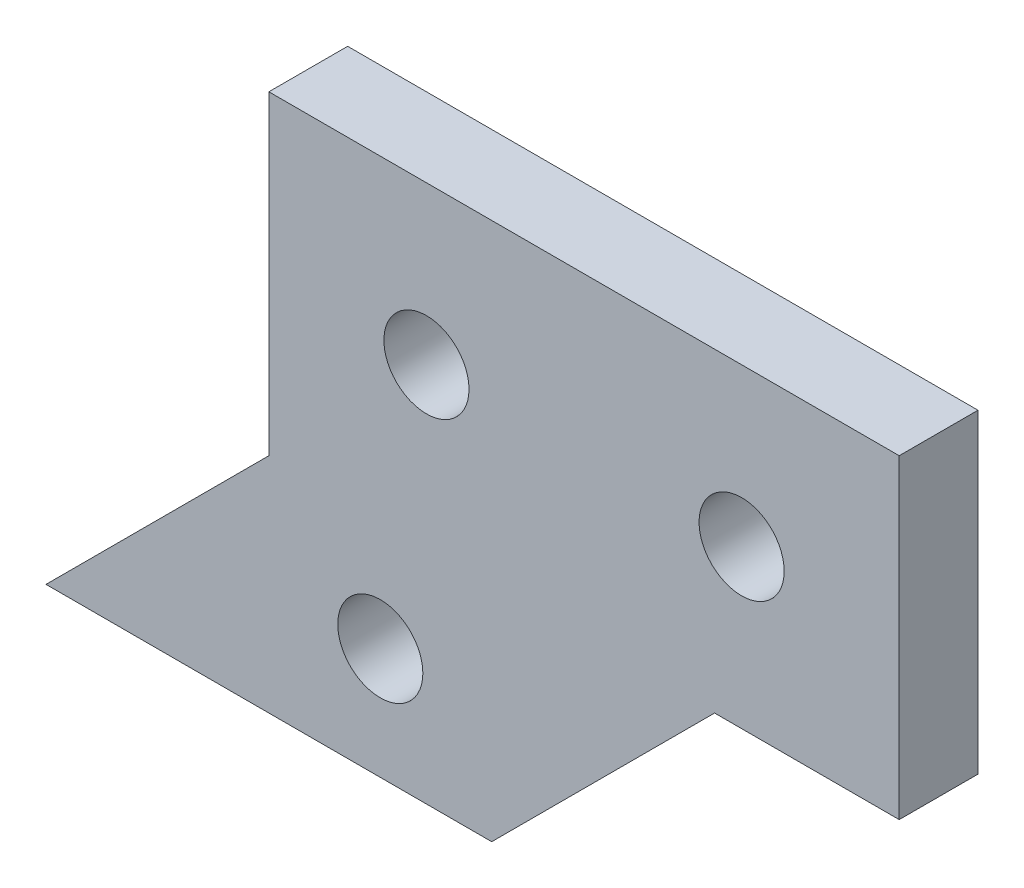
ISO-10303-21;
HEADER;
FILE_DESCRIPTION(('STEP AP214'),'2;1');
FILE_NAME('part.step','',(''),(''),'','','');
FILE_SCHEMA(('AUTOMOTIVE_DESIGN { 1 0 10303 214 1 1 1 1 }'));
ENDSEC;
DATA;
#1=APPLICATION_CONTEXT('core data for automotive mechanical design processes');
#2=APPLICATION_PROTOCOL_DEFINITION('international standard','automotive_design',2000,#1);
#3=PRODUCT_CONTEXT('',#1,'mechanical');
#4=PRODUCT('Part','Part','',(#3));
#5=PRODUCT_RELATED_PRODUCT_CATEGORY('part','',(#4));
#6=PRODUCT_DEFINITION_FORMATION('','',#4);
#7=PRODUCT_DEFINITION_CONTEXT('part definition',#1,'design');
#8=PRODUCT_DEFINITION('design','',#6,#7);
#9=PRODUCT_DEFINITION_SHAPE('','',#8);
#10=(LENGTH_UNIT() NAMED_UNIT(*) SI_UNIT(.MILLI.,.METRE.));
#11=(NAMED_UNIT(*) PLANE_ANGLE_UNIT() SI_UNIT($,.RADIAN.));
#12=(NAMED_UNIT(*) SI_UNIT($,.STERADIAN.) SOLID_ANGLE_UNIT());
#13=UNCERTAINTY_MEASURE_WITH_UNIT(LENGTH_MEASURE(1.E-05),#10,'distance_accuracy_value','');
#14=(GEOMETRIC_REPRESENTATION_CONTEXT(3) GLOBAL_UNCERTAINTY_ASSIGNED_CONTEXT((#13)) GLOBAL_UNIT_ASSIGNED_CONTEXT((#10,
#11,#12)) REPRESENTATION_CONTEXT('',''));
#15=CARTESIAN_POINT('',(0.,0.,0.));
#16=DIRECTION('',(0.,0.,1.));
#17=DIRECTION('',(1.,0.,0.));
#18=AXIS2_PLACEMENT_3D('',#15,#16,#17);
#19=CARTESIAN_POINT('',(0.,0.,6.35));
#20=DIRECTION('',(0.,0.,1.));
#21=DIRECTION('',(1.,0.,0.));
#22=AXIS2_PLACEMENT_3D('',#19,#20,#21);
#23=PLANE('',#22);
#24=CARTESIAN_POINT('',(38.1,-12.7,6.35));
#25=DIRECTION('',(0.,0.,1.));
#26=DIRECTION('',(1.,0.,0.));
#27=AXIS2_PLACEMENT_3D('',#24,#25,#26);
#28=CIRCLE('',#27,3.429);
#29=CARTESIAN_POINT('',(41.529,-12.7,6.35));
#30=VERTEX_POINT('',#29);
#31=EDGE_CURVE('E192',#30,#30,#28,.T.);
#32=ORIENTED_EDGE('',*,*,#31,.F.);
#33=EDGE_LOOP('',(#32));
#34=FACE_BOUND('',#33,.T.);
#35=DIRECTION('',(0.,-1.,0.));
#36=VECTOR('',#35,1.);
#37=CARTESIAN_POINT('',(0.,0.,6.35));
#38=LINE('',#37,#36);
#39=CARTESIAN_POINT('',(0.,0.,6.35));
#40=VERTEX_POINT('',#39);
#41=CARTESIAN_POINT('',(0.,-25.4,6.35));
#42=VERTEX_POINT('',#41);
#43=EDGE_CURVE('E155',#40,#42,#38,.T.);
#44=ORIENTED_EDGE('',*,*,#43,.T.);
#45=DIRECTION('',(-0.707106781186546,-0.707106781186549,0.));
#46=VECTOR('',#45,1.);
#47=CARTESIAN_POINT('',(0.,-25.4,6.35));
#48=LINE('',#47,#46);
#49=CARTESIAN_POINT('',(-17.9605122421383,-43.3605122421383,6.35));
#50=VERTEX_POINT('',#49);
#51=EDGE_CURVE('E97',#42,#50,#48,.T.);
#52=ORIENTED_EDGE('',*,*,#51,.T.);
#53=DIRECTION('',(1.,0.,0.));
#54=VECTOR('',#53,1.);
#55=CARTESIAN_POINT('',(-17.9605122421383,-43.3605122421383,6.35));
#56=LINE('',#55,#54);
#57=CARTESIAN_POINT('',(17.9605122421383,-43.3605122421383,6.35));
#58=VERTEX_POINT('',#57);
#59=EDGE_CURVE('E172',#50,#58,#56,.T.);
#60=ORIENTED_EDGE('',*,*,#59,.T.);
#61=DIRECTION('',(0.707106781186546,0.707106781186549,0.));
#62=VECTOR('',#61,1.);
#63=CARTESIAN_POINT('',(35.9210244842765,-25.4,6.35));
#64=LINE('',#63,#62);
#65=CARTESIAN_POINT('',(35.9210244842765,-25.4,6.35));
#66=VERTEX_POINT('',#65);
#67=EDGE_CURVE('E113',#58,#66,#64,.T.);
#68=ORIENTED_EDGE('',*,*,#67,.T.);
#69=DIRECTION('',(1.,0.,0.));
#70=VECTOR('',#69,1.);
#71=CARTESIAN_POINT('',(35.9210244842765,-25.4,6.35));
#72=LINE('',#71,#70);
#73=CARTESIAN_POINT('',(50.8,-25.4,6.35));
#74=VERTEX_POINT('',#73);
#75=EDGE_CURVE('E107',#66,#74,#72,.T.);
#76=ORIENTED_EDGE('',*,*,#75,.T.);
#77=DIRECTION('',(0.,1.,0.));
#78=VECTOR('',#77,1.);
#79=CARTESIAN_POINT('',(50.8,0.,6.35));
#80=LINE('',#79,#78);
#81=CARTESIAN_POINT('',(50.8,0.,6.35));
#82=VERTEX_POINT('',#81);
#83=EDGE_CURVE('E111',#74,#82,#80,.T.);
#84=ORIENTED_EDGE('',*,*,#83,.T.);
#85=DIRECTION('',(-1.,0.,0.));
#86=VECTOR('',#85,1.);
#87=CARTESIAN_POINT('',(0.,0.,6.35));
#88=LINE('',#87,#86);
#89=EDGE_CURVE('E57',#82,#40,#88,.T.);
#90=ORIENTED_EDGE('',*,*,#89,.T.);
#91=EDGE_LOOP('',(#44,#52,#60,#68,#76,#84,#90));
#92=FACE_BOUND('',#91,.T.);
#93=CARTESIAN_POINT('',(12.7,-12.7,6.35));
#94=DIRECTION('',(0.,0.,1.));
#95=DIRECTION('',(1.,0.,0.));
#96=AXIS2_PLACEMENT_3D('',#93,#94,#95);
#97=CIRCLE('',#96,3.429);
#98=CARTESIAN_POINT('',(16.129,-12.7,6.35));
#99=VERTEX_POINT('',#98);
#100=EDGE_CURVE('E140',#99,#99,#97,.T.);
#101=ORIENTED_EDGE('',*,*,#100,.F.);
#102=EDGE_LOOP('',(#101));
#103=FACE_BOUND('',#102,.T.);
#104=CARTESIAN_POINT('',(8.98025612106913,-34.3802561210692,6.35));
#105=DIRECTION('',(0.,0.,1.));
#106=DIRECTION('',(1.,0.,0.));
#107=AXIS2_PLACEMENT_3D('',#104,#105,#106);
#108=CIRCLE('',#107,3.42900000000001);
#109=CARTESIAN_POINT('',(12.4092561210691,-34.3802561210692,6.35));
#110=VERTEX_POINT('',#109);
#111=EDGE_CURVE('E200',#110,#110,#108,.T.);
#112=ORIENTED_EDGE('',*,*,#111,.F.);
#113=EDGE_LOOP('',(#112));
#114=FACE_BOUND('',#113,.T.);
#115=ADVANCED_FACE('F39',(#34,#92,#103,#114),#23,.T.);
#116=CARTESIAN_POINT('',(0.,0.,0.));
#117=DIRECTION('',(0.,0.,1.));
#118=DIRECTION('',(1.,0.,0.));
#119=AXIS2_PLACEMENT_3D('',#116,#117,#118);
#120=PLANE('',#119);
#121=DIRECTION('',(0.,-1.,0.));
#122=VECTOR('',#121,1.);
#123=CARTESIAN_POINT('',(0.,0.,0.));
#124=LINE('',#123,#122);
#125=CARTESIAN_POINT('',(0.,0.,0.));
#126=VERTEX_POINT('',#125);
#127=CARTESIAN_POINT('',(0.,-25.4,0.));
#128=VERTEX_POINT('',#127);
#129=EDGE_CURVE('E135',#126,#128,#124,.T.);
#130=ORIENTED_EDGE('',*,*,#129,.F.);
#131=DIRECTION('',(-1.,0.,0.));
#132=VECTOR('',#131,1.);
#133=CARTESIAN_POINT('',(0.,0.,0.));
#134=LINE('',#133,#132);
#135=CARTESIAN_POINT('',(50.8,0.,0.));
#136=VERTEX_POINT('',#135);
#137=EDGE_CURVE('E89',#136,#126,#134,.T.);
#138=ORIENTED_EDGE('',*,*,#137,.F.);
#139=DIRECTION('',(0.,1.,0.));
#140=VECTOR('',#139,1.);
#141=CARTESIAN_POINT('',(50.8,0.,0.));
#142=LINE('',#141,#140);
#143=CARTESIAN_POINT('',(50.8,-25.4,0.));
#144=VERTEX_POINT('',#143);
#145=EDGE_CURVE('E83',#144,#136,#142,.T.);
#146=ORIENTED_EDGE('',*,*,#145,.F.);
#147=DIRECTION('',(1.,0.,0.));
#148=VECTOR('',#147,1.);
#149=CARTESIAN_POINT('',(35.9210244842765,-25.4,0.));
#150=LINE('',#149,#148);
#151=CARTESIAN_POINT('',(35.9210244842765,-25.4,0.));
#152=VERTEX_POINT('',#151);
#153=EDGE_CURVE('E122',#152,#144,#150,.T.);
#154=ORIENTED_EDGE('',*,*,#153,.F.);
#155=DIRECTION('',(0.707106781186546,0.707106781186549,0.));
#156=VECTOR('',#155,1.);
#157=CARTESIAN_POINT('',(35.9210244842765,-25.4,0.));
#158=LINE('',#157,#156);
#159=CARTESIAN_POINT('',(17.9605122421383,-43.3605122421383,0.));
#160=VERTEX_POINT('',#159);
#161=EDGE_CURVE('E146',#160,#152,#158,.T.);
#162=ORIENTED_EDGE('',*,*,#161,.F.);
#163=DIRECTION('',(1.,0.,0.));
#164=VECTOR('',#163,1.);
#165=CARTESIAN_POINT('',(-17.9605122421383,-43.3605122421383,0.));
#166=LINE('',#165,#164);
#167=CARTESIAN_POINT('',(-17.9605122421383,-43.3605122421383,0.));
#168=VERTEX_POINT('',#167);
#169=EDGE_CURVE('E143',#168,#160,#166,.T.);
#170=ORIENTED_EDGE('',*,*,#169,.F.);
#171=DIRECTION('',(-0.707106781186546,-0.707106781186549,0.));
#172=VECTOR('',#171,1.);
#173=CARTESIAN_POINT('',(0.,-25.4,0.));
#174=LINE('',#173,#172);
#175=EDGE_CURVE('E139',#128,#168,#174,.T.);
#176=ORIENTED_EDGE('',*,*,#175,.F.);
#177=EDGE_LOOP('',(#130,#138,#146,#154,#162,#170,#176));
#178=FACE_BOUND('',#177,.T.);
#179=CARTESIAN_POINT('',(12.7,-12.7,0.));
#180=DIRECTION('',(0.,0.,1.));
#181=DIRECTION('',(1.,0.,0.));
#182=AXIS2_PLACEMENT_3D('',#179,#180,#181);
#183=CIRCLE('',#182,3.429);
#184=CARTESIAN_POINT('',(16.129,-12.7,0.));
#185=VERTEX_POINT('',#184);
#186=EDGE_CURVE('E188',#185,#185,#183,.T.);
#187=ORIENTED_EDGE('',*,*,#186,.T.);
#188=EDGE_LOOP('',(#187));
#189=FACE_BOUND('',#188,.T.);
#190=CARTESIAN_POINT('',(38.1,-12.7,0.));
#191=DIRECTION('',(0.,0.,1.));
#192=DIRECTION('',(1.,0.,0.));
#193=AXIS2_PLACEMENT_3D('',#190,#191,#192);
#194=CIRCLE('',#193,3.429);
#195=CARTESIAN_POINT('',(41.529,-12.7,0.));
#196=VERTEX_POINT('',#195);
#197=EDGE_CURVE('E196',#196,#196,#194,.T.);
#198=ORIENTED_EDGE('',*,*,#197,.T.);
#199=EDGE_LOOP('',(#198));
#200=FACE_BOUND('',#199,.T.);
#201=CARTESIAN_POINT('',(8.98025612106913,-34.3802561210692,0.));
#202=DIRECTION('',(0.,0.,1.));
#203=DIRECTION('',(1.,0.,0.));
#204=AXIS2_PLACEMENT_3D('',#201,#202,#203);
#205=CIRCLE('',#204,3.42900000000001);
#206=CARTESIAN_POINT('',(12.4092561210691,-34.3802561210692,0.));
#207=VERTEX_POINT('',#206);
#208=EDGE_CURVE('E204',#207,#207,#205,.T.);
#209=ORIENTED_EDGE('',*,*,#208,.T.);
#210=EDGE_LOOP('',(#209));
#211=FACE_BOUND('',#210,.T.);
#212=ADVANCED_FACE('F176',(#178,#189,#200,#211),#120,.F.);
#213=CARTESIAN_POINT('',(0.,0.,6.35));
#214=DIRECTION('',(1.,0.,0.));
#215=DIRECTION('',(0.,1.,0.));
#216=AXIS2_PLACEMENT_3D('',#213,#214,#215);
#217=PLANE('',#216);
#218=ORIENTED_EDGE('',*,*,#129,.T.);
#219=DIRECTION('',(0.,0.,-1.));
#220=VECTOR('',#219,1.);
#221=CARTESIAN_POINT('',(0.,-25.4,6.35));
#222=LINE('',#221,#220);
#223=EDGE_CURVE('E11',#42,#128,#222,.T.);
#224=ORIENTED_EDGE('',*,*,#223,.F.);
#225=ORIENTED_EDGE('',*,*,#43,.F.);
#226=DIRECTION('',(0.,0.,-1.));
#227=VECTOR('',#226,1.);
#228=CARTESIAN_POINT('',(0.,0.,6.35));
#229=LINE('',#228,#227);
#230=EDGE_CURVE('E131',#40,#126,#229,.T.);
#231=ORIENTED_EDGE('',*,*,#230,.T.);
#232=EDGE_LOOP('',(#218,#224,#225,#231));
#233=FACE_BOUND('',#232,.T.);
#234=ADVANCED_FACE('F41',(#233),#217,.F.);
#235=CARTESIAN_POINT('',(0.,-25.4,6.35));
#236=DIRECTION('',(0.707106781186549,-0.707106781186546,0.));
#237=DIRECTION('',(0.707106781186546,0.707106781186549,0.));
#238=AXIS2_PLACEMENT_3D('',#235,#236,#237);
#239=PLANE('',#238);
#240=ORIENTED_EDGE('',*,*,#175,.T.);
#241=DIRECTION('',(0.,0.,-1.));
#242=VECTOR('',#241,1.);
#243=CARTESIAN_POINT('',(-17.9605122421383,-43.3605122421383,6.35));
#244=LINE('',#243,#242);
#245=EDGE_CURVE('E49',#50,#168,#244,.T.);
#246=ORIENTED_EDGE('',*,*,#245,.F.);
#247=ORIENTED_EDGE('',*,*,#51,.F.);
#248=ORIENTED_EDGE('',*,*,#223,.T.);
#249=EDGE_LOOP('',(#240,#246,#247,#248));
#250=FACE_BOUND('',#249,.T.);
#251=ADVANCED_FACE('F237',(#250),#239,.F.);
#252=CARTESIAN_POINT('',(-17.9605122421383,-43.3605122421383,6.35));
#253=DIRECTION('',(0.,1.,0.));
#254=DIRECTION('',(0.,0.,1.));
#255=AXIS2_PLACEMENT_3D('',#252,#253,#254);
#256=PLANE('',#255);
#257=ORIENTED_EDGE('',*,*,#169,.T.);
#258=DIRECTION('',(0.,0.,-1.));
#259=VECTOR('',#258,1.);
#260=CARTESIAN_POINT('',(17.9605122421383,-43.3605122421383,6.35));
#261=LINE('',#260,#259);
#262=EDGE_CURVE('E162',#58,#160,#261,.T.);
#263=ORIENTED_EDGE('',*,*,#262,.F.);
#264=ORIENTED_EDGE('',*,*,#59,.F.);
#265=ORIENTED_EDGE('',*,*,#245,.T.);
#266=EDGE_LOOP('',(#257,#263,#264,#265));
#267=FACE_BOUND('',#266,.T.);
#268=ADVANCED_FACE('F170',(#267),#256,.F.);
#269=CARTESIAN_POINT('',(35.9210244842765,-25.4,6.35));
#270=DIRECTION('',(-0.707106781186549,0.707106781186546,0.));
#271=DIRECTION('',(-0.707106781186546,-0.707106781186549,0.));
#272=AXIS2_PLACEMENT_3D('',#269,#270,#271);
#273=PLANE('',#272);
#274=ORIENTED_EDGE('',*,*,#161,.T.);
#275=DIRECTION('',(0.,0.,-1.));
#276=VECTOR('',#275,1.);
#277=CARTESIAN_POINT('',(35.9210244842765,-25.4,6.35));
#278=LINE('',#277,#276);
#279=EDGE_CURVE('E124',#66,#152,#278,.T.);
#280=ORIENTED_EDGE('',*,*,#279,.F.);
#281=ORIENTED_EDGE('',*,*,#67,.F.);
#282=ORIENTED_EDGE('',*,*,#262,.T.);
#283=EDGE_LOOP('',(#274,#280,#281,#282));
#284=FACE_BOUND('',#283,.T.);
#285=ADVANCED_FACE('F179',(#284),#273,.F.);
#286=CARTESIAN_POINT('',(35.9210244842765,-25.4,6.35));
#287=DIRECTION('',(0.,1.,0.));
#288=DIRECTION('',(0.,0.,1.));
#289=AXIS2_PLACEMENT_3D('',#286,#287,#288);
#290=PLANE('',#289);
#291=ORIENTED_EDGE('',*,*,#153,.T.);
#292=DIRECTION('',(0.,0.,-1.));
#293=VECTOR('',#292,1.);
#294=CARTESIAN_POINT('',(50.8,-25.4,6.35));
#295=LINE('',#294,#293);
#296=EDGE_CURVE('E119',#74,#144,#295,.T.);
#297=ORIENTED_EDGE('',*,*,#296,.F.);
#298=ORIENTED_EDGE('',*,*,#75,.F.);
#299=ORIENTED_EDGE('',*,*,#279,.T.);
#300=EDGE_LOOP('',(#291,#297,#298,#299));
#301=FACE_BOUND('',#300,.T.);
#302=ADVANCED_FACE('F120',(#301),#290,.F.);
#303=CARTESIAN_POINT('',(50.8,0.,6.35));
#304=DIRECTION('',(-1.,0.,0.));
#305=DIRECTION('',(0.,0.,1.));
#306=AXIS2_PLACEMENT_3D('',#303,#304,#305);
#307=PLANE('',#306);
#308=ORIENTED_EDGE('',*,*,#145,.T.);
#309=DIRECTION('',(0.,0.,-1.));
#310=VECTOR('',#309,1.);
#311=CARTESIAN_POINT('',(50.8,0.,6.35));
#312=LINE('',#311,#310);
#313=EDGE_CURVE('E125',#82,#136,#312,.T.);
#314=ORIENTED_EDGE('',*,*,#313,.F.);
#315=ORIENTED_EDGE('',*,*,#83,.F.);
#316=ORIENTED_EDGE('',*,*,#296,.T.);
#317=EDGE_LOOP('',(#308,#314,#315,#316));
#318=FACE_BOUND('',#317,.T.);
#319=ADVANCED_FACE('F127',(#318),#307,.F.);
#320=CARTESIAN_POINT('',(0.,0.,6.35));
#321=DIRECTION('',(0.,-1.,0.));
#322=DIRECTION('',(0.,0.,-1.));
#323=AXIS2_PLACEMENT_3D('',#320,#321,#322);
#324=PLANE('',#323);
#325=ORIENTED_EDGE('',*,*,#137,.T.);
#326=ORIENTED_EDGE('',*,*,#230,.F.);
#327=ORIENTED_EDGE('',*,*,#89,.F.);
#328=ORIENTED_EDGE('',*,*,#313,.T.);
#329=EDGE_LOOP('',(#325,#326,#327,#328));
#330=FACE_BOUND('',#329,.T.);
#331=ADVANCED_FACE('F227',(#330),#324,.F.);
#332=CARTESIAN_POINT('',(12.7,-12.7,6.35));
#333=DIRECTION('',(0.,0.,-1.));
#334=DIRECTION('',(-1.,0.,0.));
#335=AXIS2_PLACEMENT_3D('',#332,#333,#334);
#336=CYLINDRICAL_SURFACE('',#335,3.429);
#337=ORIENTED_EDGE('',*,*,#100,.T.);
#338=EDGE_LOOP('',(#337));
#339=FACE_BOUND('',#338,.T.);
#340=ORIENTED_EDGE('',*,*,#186,.F.);
#341=EDGE_LOOP('',(#340));
#342=FACE_BOUND('',#341,.T.);
#343=ADVANCED_FACE('F224',(#339,#342),#336,.F.);
#344=CARTESIAN_POINT('',(38.1,-12.7,6.35));
#345=DIRECTION('',(0.,0.,-1.));
#346=DIRECTION('',(-1.,0.,0.));
#347=AXIS2_PLACEMENT_3D('',#344,#345,#346);
#348=CYLINDRICAL_SURFACE('',#347,3.429);
#349=ORIENTED_EDGE('',*,*,#31,.T.);
#350=EDGE_LOOP('',(#349));
#351=FACE_BOUND('',#350,.T.);
#352=ORIENTED_EDGE('',*,*,#197,.F.);
#353=EDGE_LOOP('',(#352));
#354=FACE_BOUND('',#353,.T.);
#355=ADVANCED_FACE('F296',(#351,#354),#348,.F.);
#356=CARTESIAN_POINT('',(8.98025612106913,-34.3802561210692,6.35));
#357=DIRECTION('',(0.,0.,-1.));
#358=DIRECTION('',(-1.,0.,0.));
#359=AXIS2_PLACEMENT_3D('',#356,#357,#358);
#360=CYLINDRICAL_SURFACE('',#359,3.42900000000001);
#361=ORIENTED_EDGE('',*,*,#111,.T.);
#362=EDGE_LOOP('',(#361));
#363=FACE_BOUND('',#362,.T.);
#364=ORIENTED_EDGE('',*,*,#208,.F.);
#365=EDGE_LOOP('',(#364));
#366=FACE_BOUND('',#365,.T.);
#367=ADVANCED_FACE('F212',(#363,#366),#360,.F.);
#368=CLOSED_SHELL('',(#115,#212,#234,#251,#268,#285,#302,#319,#331,#343,#355,#367));
#369=MANIFOLD_SOLID_BREP('B2',#368);
#370=ADVANCED_BREP_SHAPE_REPRESENTATION('',(#18,#369),#14);
#371=SHAPE_DEFINITION_REPRESENTATION(#9,#370);
ENDSEC;
END-ISO-10303-21;
